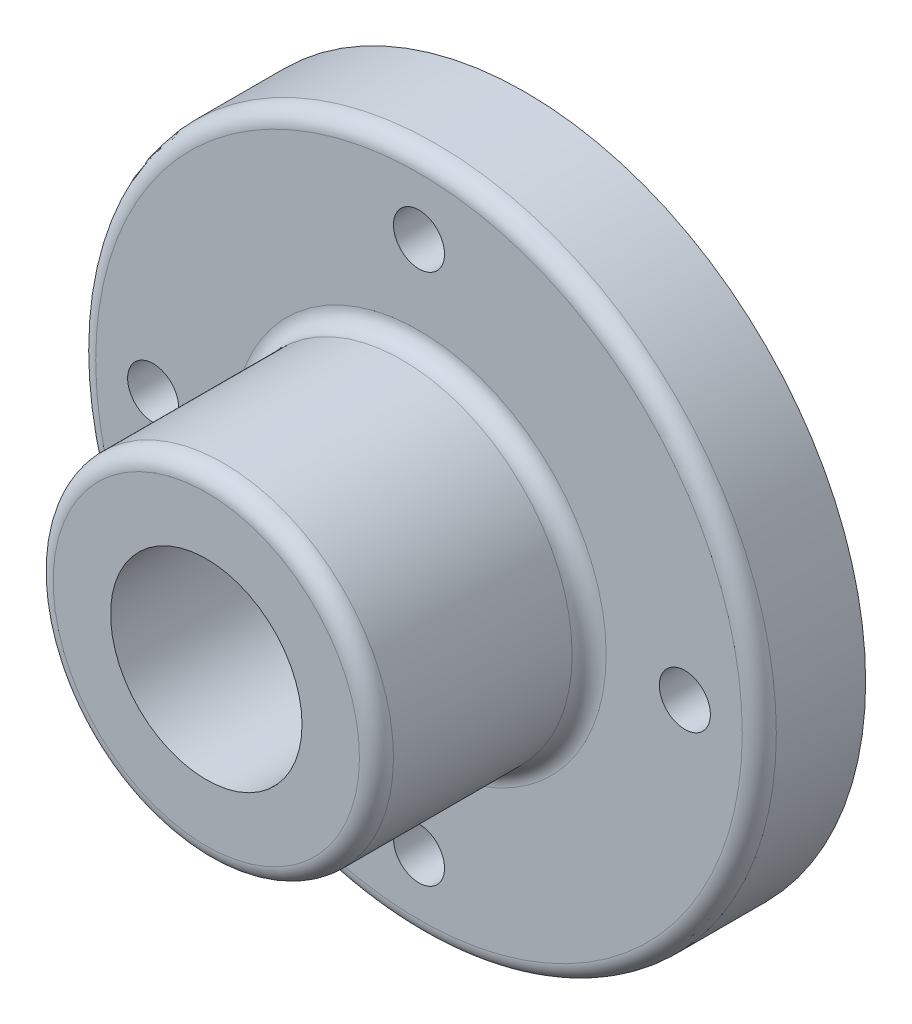
ISO-10303-21;
HEADER;
FILE_DESCRIPTION(('STEP AP214'),'2;1');
FILE_NAME('part.step','',(''),(''),'','','');
FILE_SCHEMA(('AUTOMOTIVE_DESIGN { 1 0 10303 214 1 1 1 1 }'));
ENDSEC;
DATA;
#1=APPLICATION_CONTEXT('core data for automotive mechanical design processes');
#2=APPLICATION_PROTOCOL_DEFINITION('international standard','automotive_design',2000,#1);
#3=PRODUCT_CONTEXT('',#1,'mechanical');
#4=PRODUCT('Part','Part','',(#3));
#5=PRODUCT_RELATED_PRODUCT_CATEGORY('part','',(#4));
#6=PRODUCT_DEFINITION_FORMATION('','',#4);
#7=PRODUCT_DEFINITION_CONTEXT('part definition',#1,'design');
#8=PRODUCT_DEFINITION('design','',#6,#7);
#9=PRODUCT_DEFINITION_SHAPE('','',#8);
#10=(LENGTH_UNIT() NAMED_UNIT(*) SI_UNIT(.MILLI.,.METRE.));
#11=(NAMED_UNIT(*) PLANE_ANGLE_UNIT() SI_UNIT($,.RADIAN.));
#12=(NAMED_UNIT(*) SI_UNIT($,.STERADIAN.) SOLID_ANGLE_UNIT());
#13=UNCERTAINTY_MEASURE_WITH_UNIT(LENGTH_MEASURE(1.E-05),#10,'distance_accuracy_value','');
#14=(GEOMETRIC_REPRESENTATION_CONTEXT(3) GLOBAL_UNCERTAINTY_ASSIGNED_CONTEXT((#13)) GLOBAL_UNIT_ASSIGNED_CONTEXT((#10,
#11,#12)) REPRESENTATION_CONTEXT('',''));
#15=CARTESIAN_POINT('',(0.,0.,0.));
#16=DIRECTION('',(0.,0.,1.));
#17=DIRECTION('',(1.,0.,0.));
#18=AXIS2_PLACEMENT_3D('',#15,#16,#17);
#19=CARTESIAN_POINT('',(0.,0.,25.));
#20=DIRECTION('',(0.,0.,-1.));
#21=DIRECTION('',(-1.,0.,0.));
#22=AXIS2_PLACEMENT_3D('',#19,#20,#21);
#23=CYLINDRICAL_SURFACE('',#22,80.0000000000001);
#24=CARTESIAN_POINT('',(0.,0.,21.));
#25=DIRECTION('',(0.,0.,1.));
#26=DIRECTION('',(1.,0.,0.));
#27=AXIS2_PLACEMENT_3D('',#24,#25,#26);
#28=CIRCLE('',#27,80.0000000000001);
#29=CARTESIAN_POINT('',(80.0000000000001,0.,21.));
#30=VERTEX_POINT('',#29);
#31=EDGE_CURVE('E42',#30,#30,#28,.F.);
#32=ORIENTED_EDGE('',*,*,#31,.T.);
#33=EDGE_LOOP('',(#32));
#34=FACE_BOUND('',#33,.T.);
#35=CARTESIAN_POINT('',(0.,0.,0.));
#36=DIRECTION('',(0.,0.,1.));
#37=DIRECTION('',(1.,0.,0.));
#38=AXIS2_PLACEMENT_3D('',#35,#36,#37);
#39=CIRCLE('',#38,80.0000000000001);
#40=CARTESIAN_POINT('',(80.0000000000001,0.,0.));
#41=VERTEX_POINT('',#40);
#42=EDGE_CURVE('E57',#41,#41,#39,.T.);
#43=ORIENTED_EDGE('',*,*,#42,.T.);
#44=EDGE_LOOP('',(#43));
#45=FACE_BOUND('',#44,.T.);
#46=ADVANCED_FACE('F31',(#34,#45),#23,.T.);
#47=CARTESIAN_POINT('',(0.,0.,25.));
#48=DIRECTION('',(0.,0.,1.));
#49=DIRECTION('',(1.,0.,0.));
#50=AXIS2_PLACEMENT_3D('',#47,#48,#49);
#51=PLANE('',#50);
#52=CARTESIAN_POINT('',(0.,0.,25.));
#53=DIRECTION('',(0.,0.,1.));
#54=DIRECTION('',(1.,0.,0.));
#55=AXIS2_PLACEMENT_3D('',#52,#53,#54);
#56=CIRCLE('',#55,76.0000000000001);
#57=CARTESIAN_POINT('',(76.0000000000001,0.,25.));
#58=VERTEX_POINT('',#57);
#59=EDGE_CURVE('E46',#58,#58,#56,.T.);
#60=ORIENTED_EDGE('',*,*,#59,.T.);
#61=EDGE_LOOP('',(#60));
#62=FACE_BOUND('',#61,.T.);
#63=CARTESIAN_POINT('',(0.,0.,25.));
#64=DIRECTION('',(0.,0.,1.));
#65=DIRECTION('',(1.,0.,0.));
#66=AXIS2_PLACEMENT_3D('',#63,#64,#65);
#67=CIRCLE('',#66,44.);
#68=CARTESIAN_POINT('',(44.,0.,25.));
#69=VERTEX_POINT('',#68);
#70=EDGE_CURVE('E54',#69,#69,#67,.F.);
#71=ORIENTED_EDGE('',*,*,#70,.T.);
#72=EDGE_LOOP('',(#71));
#73=FACE_BOUND('',#72,.T.);
#74=CARTESIAN_POINT('',(62.5,0.,25.));
#75=DIRECTION('',(0.,0.,1.));
#76=DIRECTION('',(1.,0.,0.));
#77=AXIS2_PLACEMENT_3D('',#74,#75,#76);
#78=CIRCLE('',#77,5.99999999999997);
#79=CARTESIAN_POINT('',(68.5,0.,25.));
#80=VERTEX_POINT('',#79);
#81=EDGE_CURVE('E72',#80,#80,#78,.T.);
#82=ORIENTED_EDGE('',*,*,#81,.F.);
#83=EDGE_LOOP('',(#82));
#84=FACE_BOUND('',#83,.T.);
#85=CARTESIAN_POINT('',(0.,-62.5,25.));
#86=DIRECTION('',(0.,0.,1.));
#87=DIRECTION('',(1.,0.,0.));
#88=AXIS2_PLACEMENT_3D('',#85,#86,#87);
#89=CIRCLE('',#88,5.99999999999999);
#90=CARTESIAN_POINT('',(6.00000000000002,-62.5,25.));
#91=VERTEX_POINT('',#90);
#92=EDGE_CURVE('E77',#91,#91,#89,.T.);
#93=ORIENTED_EDGE('',*,*,#92,.F.);
#94=EDGE_LOOP('',(#93));
#95=FACE_BOUND('',#94,.T.);
#96=CARTESIAN_POINT('',(-62.5,0.,25.));
#97=DIRECTION('',(0.,0.,1.));
#98=DIRECTION('',(1.,0.,0.));
#99=AXIS2_PLACEMENT_3D('',#96,#97,#98);
#100=CIRCLE('',#99,6.00000000000002);
#101=CARTESIAN_POINT('',(-56.5,0.,25.));
#102=VERTEX_POINT('',#101);
#103=EDGE_CURVE('E66',#102,#102,#100,.T.);
#104=ORIENTED_EDGE('',*,*,#103,.F.);
#105=EDGE_LOOP('',(#104));
#106=FACE_BOUND('',#105,.T.);
#107=CARTESIAN_POINT('',(0.,62.5,25.));
#108=DIRECTION('',(0.,0.,1.));
#109=DIRECTION('',(1.,0.,0.));
#110=AXIS2_PLACEMENT_3D('',#107,#108,#109);
#111=CIRCLE('',#110,6.00000000000001);
#112=CARTESIAN_POINT('',(6.00000000000003,62.5,25.));
#113=VERTEX_POINT('',#112);
#114=EDGE_CURVE('E60',#113,#113,#111,.T.);
#115=ORIENTED_EDGE('',*,*,#114,.F.);
#116=EDGE_LOOP('',(#115));
#117=FACE_BOUND('',#116,.T.);
#118=ADVANCED_FACE('F111',(#62,#73,#84,#95,#106,#117),#51,.T.);
#119=CARTESIAN_POINT('',(0.,0.,0.));
#120=DIRECTION('',(0.,0.,1.));
#121=DIRECTION('',(1.,0.,0.));
#122=AXIS2_PLACEMENT_3D('',#119,#120,#121);
#123=PLANE('',#122);
#124=CARTESIAN_POINT('',(0.,0.,0.));
#125=DIRECTION('',(0.,0.,1.));
#126=DIRECTION('',(1.,0.,0.));
#127=AXIS2_PLACEMENT_3D('',#124,#125,#126);
#128=CIRCLE('',#127,22.5);
#129=CARTESIAN_POINT('',(22.5,0.,0.));
#130=VERTEX_POINT('',#129);
#131=EDGE_CURVE('E87',#130,#130,#128,.T.);
#132=ORIENTED_EDGE('',*,*,#131,.T.);
#133=EDGE_LOOP('',(#132));
#134=FACE_BOUND('',#133,.T.);
#135=CARTESIAN_POINT('',(62.5,0.,0.));
#136=DIRECTION('',(0.,0.,1.));
#137=DIRECTION('',(1.,0.,0.));
#138=AXIS2_PLACEMENT_3D('',#135,#136,#137);
#139=CIRCLE('',#138,5.99999999999997);
#140=CARTESIAN_POINT('',(68.5,0.,0.));
#141=VERTEX_POINT('',#140);
#142=EDGE_CURVE('E76',#141,#141,#139,.T.);
#143=ORIENTED_EDGE('',*,*,#142,.T.);
#144=EDGE_LOOP('',(#143));
#145=FACE_BOUND('',#144,.T.);
#146=CARTESIAN_POINT('',(0.,-62.5,0.));
#147=DIRECTION('',(0.,0.,1.));
#148=DIRECTION('',(1.,0.,0.));
#149=AXIS2_PLACEMENT_3D('',#146,#147,#148);
#150=CIRCLE('',#149,5.99999999999999);
#151=CARTESIAN_POINT('',(6.00000000000002,-62.5,0.));
#152=VERTEX_POINT('',#151);
#153=EDGE_CURVE('E73',#152,#152,#150,.T.);
#154=ORIENTED_EDGE('',*,*,#153,.T.);
#155=EDGE_LOOP('',(#154));
#156=FACE_BOUND('',#155,.T.);
#157=CARTESIAN_POINT('',(-62.5,0.,0.));
#158=DIRECTION('',(0.,0.,1.));
#159=DIRECTION('',(1.,0.,0.));
#160=AXIS2_PLACEMENT_3D('',#157,#158,#159);
#161=CIRCLE('',#160,6.00000000000002);
#162=CARTESIAN_POINT('',(-56.5,0.,0.));
#163=VERTEX_POINT('',#162);
#164=EDGE_CURVE('E69',#163,#163,#161,.T.);
#165=ORIENTED_EDGE('',*,*,#164,.T.);
#166=EDGE_LOOP('',(#165));
#167=FACE_BOUND('',#166,.T.);
#168=CARTESIAN_POINT('',(0.,62.5,0.));
#169=DIRECTION('',(0.,0.,1.));
#170=DIRECTION('',(1.,0.,0.));
#171=AXIS2_PLACEMENT_3D('',#168,#169,#170);
#172=CIRCLE('',#171,6.00000000000001);
#173=CARTESIAN_POINT('',(6.00000000000003,62.5,0.));
#174=VERTEX_POINT('',#173);
#175=EDGE_CURVE('E63',#174,#174,#172,.T.);
#176=ORIENTED_EDGE('',*,*,#175,.T.);
#177=EDGE_LOOP('',(#176));
#178=FACE_BOUND('',#177,.T.);
#179=ORIENTED_EDGE('',*,*,#42,.F.);
#180=EDGE_LOOP('',(#179));
#181=FACE_BOUND('',#180,.T.);
#182=ADVANCED_FACE('F91',(#134,#145,#156,#167,#178,#181),#123,.F.);
#183=CARTESIAN_POINT('',(0.,0.,75.));
#184=DIRECTION('',(0.,0.,-1.));
#185=DIRECTION('',(-1.,0.,0.));
#186=AXIS2_PLACEMENT_3D('',#183,#184,#185);
#187=CYLINDRICAL_SURFACE('',#186,40.);
#188=CARTESIAN_POINT('',(0.,0.,71.));
#189=DIRECTION('',(0.,0.,1.));
#190=DIRECTION('',(1.,0.,0.));
#191=AXIS2_PLACEMENT_3D('',#188,#189,#190);
#192=CIRCLE('',#191,40.);
#193=CARTESIAN_POINT('',(40.,0.,71.));
#194=VERTEX_POINT('',#193);
#195=EDGE_CURVE('E10',#194,#194,#192,.F.);
#196=ORIENTED_EDGE('',*,*,#195,.T.);
#197=EDGE_LOOP('',(#196));
#198=FACE_BOUND('',#197,.T.);
#199=CARTESIAN_POINT('',(0.,0.,29.));
#200=DIRECTION('',(0.,0.,1.));
#201=DIRECTION('',(1.,0.,0.));
#202=AXIS2_PLACEMENT_3D('',#199,#200,#201);
#203=CIRCLE('',#202,40.);
#204=CARTESIAN_POINT('',(40.,0.,29.));
#205=VERTEX_POINT('',#204);
#206=EDGE_CURVE('E51',#205,#205,#203,.T.);
#207=ORIENTED_EDGE('',*,*,#206,.T.);
#208=EDGE_LOOP('',(#207));
#209=FACE_BOUND('',#208,.T.);
#210=ADVANCED_FACE('F151',(#198,#209),#187,.T.);
#211=CARTESIAN_POINT('',(0.,0.,75.));
#212=DIRECTION('',(0.,0.,1.));
#213=DIRECTION('',(1.,0.,0.));
#214=AXIS2_PLACEMENT_3D('',#211,#212,#213);
#215=PLANE('',#214);
#216=CARTESIAN_POINT('',(0.,0.,75.));
#217=DIRECTION('',(0.,0.,1.));
#218=DIRECTION('',(1.,0.,0.));
#219=AXIS2_PLACEMENT_3D('',#216,#217,#218);
#220=CIRCLE('',#219,36.);
#221=CARTESIAN_POINT('',(36.,0.,75.));
#222=VERTEX_POINT('',#221);
#223=EDGE_CURVE('E38',#222,#222,#220,.T.);
#224=ORIENTED_EDGE('',*,*,#223,.T.);
#225=EDGE_LOOP('',(#224));
#226=FACE_BOUND('',#225,.T.);
#227=CARTESIAN_POINT('',(0.,0.,75.));
#228=DIRECTION('',(0.,0.,1.));
#229=DIRECTION('',(1.,0.,0.));
#230=AXIS2_PLACEMENT_3D('',#227,#228,#229);
#231=CIRCLE('',#230,22.5);
#232=CARTESIAN_POINT('',(22.5,0.,75.));
#233=VERTEX_POINT('',#232);
#234=EDGE_CURVE('E80',#233,#233,#231,.T.);
#235=ORIENTED_EDGE('',*,*,#234,.F.);
#236=EDGE_LOOP('',(#235));
#237=FACE_BOUND('',#236,.T.);
#238=ADVANCED_FACE('F145',(#226,#237),#215,.T.);
#239=CARTESIAN_POINT('',(0.,62.5,75.001));
#240=DIRECTION('',(0.,0.,-1.));
#241=DIRECTION('',(-1.,0.,0.));
#242=AXIS2_PLACEMENT_3D('',#239,#240,#241);
#243=CYLINDRICAL_SURFACE('',#242,6.00000000000001);
#244=ORIENTED_EDGE('',*,*,#114,.T.);
#245=EDGE_LOOP('',(#244));
#246=FACE_BOUND('',#245,.T.);
#247=ORIENTED_EDGE('',*,*,#175,.F.);
#248=EDGE_LOOP('',(#247));
#249=FACE_BOUND('',#248,.T.);
#250=ADVANCED_FACE('F141',(#246,#249),#243,.F.);
#251=CARTESIAN_POINT('',(-62.5,0.,75.001));
#252=DIRECTION('',(0.,0.,-1.));
#253=DIRECTION('',(-1.,0.,0.));
#254=AXIS2_PLACEMENT_3D('',#251,#252,#253);
#255=CYLINDRICAL_SURFACE('',#254,6.00000000000002);
#256=ORIENTED_EDGE('',*,*,#103,.T.);
#257=EDGE_LOOP('',(#256));
#258=FACE_BOUND('',#257,.T.);
#259=ORIENTED_EDGE('',*,*,#164,.F.);
#260=EDGE_LOOP('',(#259));
#261=FACE_BOUND('',#260,.T.);
#262=ADVANCED_FACE('F144',(#258,#261),#255,.F.);
#263=CARTESIAN_POINT('',(0.,-62.5,75.001));
#264=DIRECTION('',(0.,0.,-1.));
#265=DIRECTION('',(-1.,0.,0.));
#266=AXIS2_PLACEMENT_3D('',#263,#264,#265);
#267=CYLINDRICAL_SURFACE('',#266,5.99999999999999);
#268=ORIENTED_EDGE('',*,*,#92,.T.);
#269=EDGE_LOOP('',(#268));
#270=FACE_BOUND('',#269,.T.);
#271=ORIENTED_EDGE('',*,*,#153,.F.);
#272=EDGE_LOOP('',(#271));
#273=FACE_BOUND('',#272,.T.);
#274=ADVANCED_FACE('F107',(#270,#273),#267,.F.);
#275=CARTESIAN_POINT('',(62.5,0.,75.001));
#276=DIRECTION('',(0.,0.,-1.));
#277=DIRECTION('',(-1.,0.,0.));
#278=AXIS2_PLACEMENT_3D('',#275,#276,#277);
#279=CYLINDRICAL_SURFACE('',#278,5.99999999999997);
#280=ORIENTED_EDGE('',*,*,#81,.T.);
#281=EDGE_LOOP('',(#280));
#282=FACE_BOUND('',#281,.T.);
#283=ORIENTED_EDGE('',*,*,#142,.F.);
#284=EDGE_LOOP('',(#283));
#285=FACE_BOUND('',#284,.T.);
#286=ADVANCED_FACE('F97',(#282,#285),#279,.F.);
#287=CARTESIAN_POINT('',(0.,0.,75.001));
#288=DIRECTION('',(0.,0.,-1.));
#289=DIRECTION('',(-1.,0.,0.));
#290=AXIS2_PLACEMENT_3D('',#287,#288,#289);
#291=CYLINDRICAL_SURFACE('',#290,22.5);
#292=ORIENTED_EDGE('',*,*,#234,.T.);
#293=EDGE_LOOP('',(#292));
#294=FACE_BOUND('',#293,.T.);
#295=ORIENTED_EDGE('',*,*,#131,.F.);
#296=EDGE_LOOP('',(#295));
#297=FACE_BOUND('',#296,.T.);
#298=ADVANCED_FACE('F94',(#294,#297),#291,.F.);
#299=CARTESIAN_POINT('',(0.,0.,29.));
#300=DIRECTION('',(0.,0.,1.));
#301=DIRECTION('',(1.,0.,0.));
#302=AXIS2_PLACEMENT_3D('',#299,#300,#301);
#303=TOROIDAL_SURFACE('',#302,44.,4.);
#304=ORIENTED_EDGE('',*,*,#206,.F.);
#305=EDGE_LOOP('',(#304));
#306=FACE_BOUND('',#305,.T.);
#307=ORIENTED_EDGE('',*,*,#70,.F.);
#308=EDGE_LOOP('',(#307));
#309=FACE_BOUND('',#308,.T.);
#310=ADVANCED_FACE('F96',(#306,#309),#303,.F.);
#311=CARTESIAN_POINT('',(0.,0.,21.));
#312=DIRECTION('',(0.,0.,1.));
#313=DIRECTION('',(1.,0.,0.));
#314=AXIS2_PLACEMENT_3D('',#311,#312,#313);
#315=TOROIDAL_SURFACE('',#314,76.0000000000001,4.);
#316=ORIENTED_EDGE('',*,*,#31,.F.);
#317=EDGE_LOOP('',(#316));
#318=FACE_BOUND('',#317,.T.);
#319=ORIENTED_EDGE('',*,*,#59,.F.);
#320=EDGE_LOOP('',(#319));
#321=FACE_BOUND('',#320,.T.);
#322=ADVANCED_FACE('F104',(#318,#321),#315,.T.);
#323=CARTESIAN_POINT('',(0.,0.,71.));
#324=DIRECTION('',(0.,0.,1.));
#325=DIRECTION('',(1.,0.,0.));
#326=AXIS2_PLACEMENT_3D('',#323,#324,#325);
#327=TOROIDAL_SURFACE('',#326,36.,4.);
#328=ORIENTED_EDGE('',*,*,#195,.F.);
#329=EDGE_LOOP('',(#328));
#330=FACE_BOUND('',#329,.T.);
#331=ORIENTED_EDGE('',*,*,#223,.F.);
#332=EDGE_LOOP('',(#331));
#333=FACE_BOUND('',#332,.T.);
#334=ADVANCED_FACE('F33',(#330,#333),#327,.T.);
#335=CLOSED_SHELL('',(#46,#118,#182,#210,#238,#250,#262,#274,#286,#298,#310,#322,#334));
#336=MANIFOLD_SOLID_BREP('B2',#335);
#337=ADVANCED_BREP_SHAPE_REPRESENTATION('',(#18,#336),#14);
#338=SHAPE_DEFINITION_REPRESENTATION(#9,#337);
ENDSEC;
END-ISO-10303-21;
